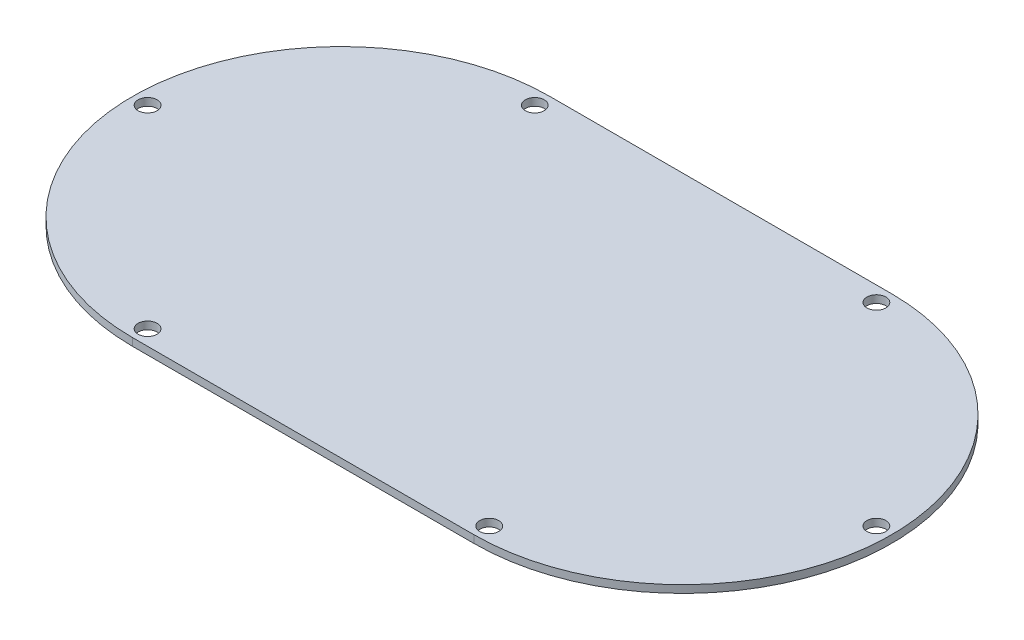
ISO-10303-21;
HEADER;
FILE_DESCRIPTION(('STEP AP214'),'2;1');
FILE_NAME('part.step','',(''),(''),'','','');
FILE_SCHEMA(('AUTOMOTIVE_DESIGN { 1 0 10303 214 1 1 1 1 }'));
ENDSEC;
DATA;
#1=APPLICATION_CONTEXT('core data for automotive mechanical design processes');
#2=APPLICATION_PROTOCOL_DEFINITION('international standard','automotive_design',2000,#1);
#3=PRODUCT_CONTEXT('',#1,'mechanical');
#4=PRODUCT('Part','Part','',(#3));
#5=PRODUCT_RELATED_PRODUCT_CATEGORY('part','',(#4));
#6=PRODUCT_DEFINITION_FORMATION('','',#4);
#7=PRODUCT_DEFINITION_CONTEXT('part definition',#1,'design');
#8=PRODUCT_DEFINITION('design','',#6,#7);
#9=PRODUCT_DEFINITION_SHAPE('','',#8);
#10=(LENGTH_UNIT() NAMED_UNIT(*) SI_UNIT(.MILLI.,.METRE.));
#11=(NAMED_UNIT(*) PLANE_ANGLE_UNIT() SI_UNIT($,.RADIAN.));
#12=(NAMED_UNIT(*) SI_UNIT($,.STERADIAN.) SOLID_ANGLE_UNIT());
#13=UNCERTAINTY_MEASURE_WITH_UNIT(LENGTH_MEASURE(1.E-05),#10,'distance_accuracy_value','');
#14=(GEOMETRIC_REPRESENTATION_CONTEXT(3) GLOBAL_UNCERTAINTY_ASSIGNED_CONTEXT((#13)) GLOBAL_UNIT_ASSIGNED_CONTEXT((#10,
#11,#12)) REPRESENTATION_CONTEXT('',''));
#15=CARTESIAN_POINT('',(0.,0.,0.));
#16=DIRECTION('',(0.,0.,1.));
#17=DIRECTION('',(1.,0.,0.));
#18=AXIS2_PLACEMENT_3D('',#15,#16,#17);
#19=CARTESIAN_POINT('',(-45.,2.,0.));
#20=DIRECTION('',(0.,1.,0.));
#21=DIRECTION('',(0.,0.,1.));
#22=AXIS2_PLACEMENT_3D('',#19,#20,#21);
#23=PLANE('',#22);
#24=CARTESIAN_POINT('',(96.,2.,0.));
#25=DIRECTION('',(0.,1.,0.));
#26=DIRECTION('',(0.,0.,-1.));
#27=AXIS2_PLACEMENT_3D('',#24,#25,#26);
#28=CIRCLE('',#27,2.49999999999999);
#29=CARTESIAN_POINT('',(96.,2.,-2.49999999999999));
#30=VERTEX_POINT('',#29);
#31=EDGE_CURVE('E139',#30,#30,#28,.T.);
#32=ORIENTED_EDGE('',*,*,#31,.F.);
#33=EDGE_LOOP('',(#32));
#34=FACE_BOUND('',#33,.T.);
#35=CARTESIAN_POINT('',(-45.,2.,51.));
#36=DIRECTION('',(0.,1.,0.));
#37=DIRECTION('',(0.,0.,1.));
#38=AXIS2_PLACEMENT_3D('',#35,#36,#37);
#39=CIRCLE('',#38,2.5);
#40=CARTESIAN_POINT('',(-45.,2.,53.5));
#41=VERTEX_POINT('',#40);
#42=EDGE_CURVE('E127',#41,#41,#39,.T.);
#43=ORIENTED_EDGE('',*,*,#42,.F.);
#44=EDGE_LOOP('',(#43));
#45=FACE_BOUND('',#44,.T.);
#46=CARTESIAN_POINT('',(-45.,2.,-51.));
#47=DIRECTION('',(0.,1.,0.));
#48=DIRECTION('',(0.,0.,1.));
#49=AXIS2_PLACEMENT_3D('',#46,#47,#48);
#50=CIRCLE('',#49,2.5);
#51=CARTESIAN_POINT('',(-45.,2.,-48.5));
#52=VERTEX_POINT('',#51);
#53=EDGE_CURVE('E106',#52,#52,#50,.T.);
#54=ORIENTED_EDGE('',*,*,#53,.F.);
#55=EDGE_LOOP('',(#54));
#56=FACE_BOUND('',#55,.T.);
#57=CARTESIAN_POINT('',(-45.,2.,0.));
#58=DIRECTION('',(0.,1.,0.));
#59=DIRECTION('',(0.,0.,1.));
#60=AXIS2_PLACEMENT_3D('',#57,#58,#59);
#61=CIRCLE('',#60,55.);
#62=CARTESIAN_POINT('',(-45.,2.,-55.));
#63=VERTEX_POINT('',#62);
#64=CARTESIAN_POINT('',(-45.,2.,55.));
#65=VERTEX_POINT('',#64);
#66=EDGE_CURVE('E91',#63,#65,#61,.T.);
#67=ORIENTED_EDGE('',*,*,#66,.T.);
#68=DIRECTION('',(1.,0.,0.));
#69=VECTOR('',#68,1.);
#70=CARTESIAN_POINT('',(-45.,2.,55.));
#71=LINE('',#70,#69);
#72=CARTESIAN_POINT('',(45.,2.,55.));
#73=VERTEX_POINT('',#72);
#74=EDGE_CURVE('E86',#65,#73,#71,.T.);
#75=ORIENTED_EDGE('',*,*,#74,.T.);
#76=CARTESIAN_POINT('',(45.,2.,0.));
#77=DIRECTION('',(0.,1.,0.));
#78=DIRECTION('',(0.,0.,1.));
#79=AXIS2_PLACEMENT_3D('',#76,#77,#78);
#80=CIRCLE('',#79,55.);
#81=CARTESIAN_POINT('',(45.,2.,-55.));
#82=VERTEX_POINT('',#81);
#83=EDGE_CURVE('E89',#73,#82,#80,.T.);
#84=ORIENTED_EDGE('',*,*,#83,.T.);
#85=DIRECTION('',(-1.,0.,0.));
#86=VECTOR('',#85,1.);
#87=CARTESIAN_POINT('',(-45.,2.,-55.));
#88=LINE('',#87,#86);
#89=EDGE_CURVE('E56',#82,#63,#88,.T.);
#90=ORIENTED_EDGE('',*,*,#89,.T.);
#91=EDGE_LOOP('',(#67,#75,#84,#90));
#92=FACE_BOUND('',#91,.T.);
#93=CARTESIAN_POINT('',(-96.,2.,0.));
#94=DIRECTION('',(0.,1.,0.));
#95=DIRECTION('',(0.,0.,1.));
#96=AXIS2_PLACEMENT_3D('',#93,#94,#95);
#97=CIRCLE('',#96,2.49999999999999);
#98=CARTESIAN_POINT('',(-96.,2.,2.5));
#99=VERTEX_POINT('',#98);
#100=EDGE_CURVE('E121',#99,#99,#97,.T.);
#101=ORIENTED_EDGE('',*,*,#100,.F.);
#102=EDGE_LOOP('',(#101));
#103=FACE_BOUND('',#102,.T.);
#104=CARTESIAN_POINT('',(45.,2.,51.));
#105=DIRECTION('',(0.,1.,0.));
#106=DIRECTION('',(0.,0.,-1.));
#107=AXIS2_PLACEMENT_3D('',#104,#105,#106);
#108=CIRCLE('',#107,2.5);
#109=CARTESIAN_POINT('',(45.,2.,48.5));
#110=VERTEX_POINT('',#109);
#111=EDGE_CURVE('E133',#110,#110,#108,.T.);
#112=ORIENTED_EDGE('',*,*,#111,.F.);
#113=EDGE_LOOP('',(#112));
#114=FACE_BOUND('',#113,.T.);
#115=CARTESIAN_POINT('',(45.,2.,-51.));
#116=DIRECTION('',(0.,1.,0.));
#117=DIRECTION('',(0.,0.,-1.));
#118=AXIS2_PLACEMENT_3D('',#115,#116,#117);
#119=CIRCLE('',#118,2.5);
#120=CARTESIAN_POINT('',(45.,2.,-53.5));
#121=VERTEX_POINT('',#120);
#122=EDGE_CURVE('E145',#121,#121,#119,.T.);
#123=ORIENTED_EDGE('',*,*,#122,.F.);
#124=EDGE_LOOP('',(#123));
#125=FACE_BOUND('',#124,.T.);
#126=ADVANCED_FACE('F39',(#34,#45,#56,#92,#103,#114,#125),#23,.T.);
#127=CARTESIAN_POINT('',(-45.,0.,0.));
#128=DIRECTION('',(0.,1.,0.));
#129=DIRECTION('',(0.,0.,1.));
#130=AXIS2_PLACEMENT_3D('',#127,#128,#129);
#131=PLANE('',#130);
#132=CARTESIAN_POINT('',(-45.,0.,0.));
#133=DIRECTION('',(0.,1.,0.));
#134=DIRECTION('',(0.,0.,1.));
#135=AXIS2_PLACEMENT_3D('',#132,#133,#134);
#136=CIRCLE('',#135,55.);
#137=CARTESIAN_POINT('',(-45.,0.,-55.));
#138=VERTEX_POINT('',#137);
#139=CARTESIAN_POINT('',(-45.,0.,55.));
#140=VERTEX_POINT('',#139);
#141=EDGE_CURVE('E103',#138,#140,#136,.T.);
#142=ORIENTED_EDGE('',*,*,#141,.F.);
#143=DIRECTION('',(-1.,0.,0.));
#144=VECTOR('',#143,1.);
#145=CARTESIAN_POINT('',(-45.,0.,-55.));
#146=LINE('',#145,#144);
#147=CARTESIAN_POINT('',(45.,0.,-55.));
#148=VERTEX_POINT('',#147);
#149=EDGE_CURVE('E79',#148,#138,#146,.T.);
#150=ORIENTED_EDGE('',*,*,#149,.F.);
#151=CARTESIAN_POINT('',(45.,0.,0.));
#152=DIRECTION('',(0.,1.,0.));
#153=DIRECTION('',(0.,0.,1.));
#154=AXIS2_PLACEMENT_3D('',#151,#152,#153);
#155=CIRCLE('',#154,55.);
#156=CARTESIAN_POINT('',(45.,0.,55.));
#157=VERTEX_POINT('',#156);
#158=EDGE_CURVE('E73',#157,#148,#155,.T.);
#159=ORIENTED_EDGE('',*,*,#158,.F.);
#160=DIRECTION('',(1.,0.,0.));
#161=VECTOR('',#160,1.);
#162=CARTESIAN_POINT('',(-45.,0.,55.));
#163=LINE('',#162,#161);
#164=EDGE_CURVE('E95',#140,#157,#163,.T.);
#165=ORIENTED_EDGE('',*,*,#164,.F.);
#166=EDGE_LOOP('',(#142,#150,#159,#165));
#167=FACE_BOUND('',#166,.T.);
#168=CARTESIAN_POINT('',(-45.,0.,-51.));
#169=DIRECTION('',(0.,1.,0.));
#170=DIRECTION('',(0.,0.,1.));
#171=AXIS2_PLACEMENT_3D('',#168,#169,#170);
#172=CIRCLE('',#171,2.5);
#173=CARTESIAN_POINT('',(-45.,0.,-48.5));
#174=VERTEX_POINT('',#173);
#175=EDGE_CURVE('E118',#174,#174,#172,.T.);
#176=ORIENTED_EDGE('',*,*,#175,.T.);
#177=EDGE_LOOP('',(#176));
#178=FACE_BOUND('',#177,.T.);
#179=CARTESIAN_POINT('',(-96.,0.,0.));
#180=DIRECTION('',(0.,1.,0.));
#181=DIRECTION('',(0.,0.,1.));
#182=AXIS2_PLACEMENT_3D('',#179,#180,#181);
#183=CIRCLE('',#182,2.49999999999999);
#184=CARTESIAN_POINT('',(-96.,0.,2.5));
#185=VERTEX_POINT('',#184);
#186=EDGE_CURVE('E124',#185,#185,#183,.T.);
#187=ORIENTED_EDGE('',*,*,#186,.T.);
#188=EDGE_LOOP('',(#187));
#189=FACE_BOUND('',#188,.T.);
#190=CARTESIAN_POINT('',(-45.,0.,51.));
#191=DIRECTION('',(0.,1.,0.));
#192=DIRECTION('',(0.,0.,1.));
#193=AXIS2_PLACEMENT_3D('',#190,#191,#192);
#194=CIRCLE('',#193,2.5);
#195=CARTESIAN_POINT('',(-45.,0.,53.5));
#196=VERTEX_POINT('',#195);
#197=EDGE_CURVE('E130',#196,#196,#194,.T.);
#198=ORIENTED_EDGE('',*,*,#197,.T.);
#199=EDGE_LOOP('',(#198));
#200=FACE_BOUND('',#199,.T.);
#201=CARTESIAN_POINT('',(45.,0.,51.));
#202=DIRECTION('',(0.,1.,0.));
#203=DIRECTION('',(0.,0.,-1.));
#204=AXIS2_PLACEMENT_3D('',#201,#202,#203);
#205=CIRCLE('',#204,2.5);
#206=CARTESIAN_POINT('',(45.,0.,48.5));
#207=VERTEX_POINT('',#206);
#208=EDGE_CURVE('E136',#207,#207,#205,.T.);
#209=ORIENTED_EDGE('',*,*,#208,.T.);
#210=EDGE_LOOP('',(#209));
#211=FACE_BOUND('',#210,.T.);
#212=CARTESIAN_POINT('',(96.,0.,0.));
#213=DIRECTION('',(0.,1.,0.));
#214=DIRECTION('',(0.,0.,-1.));
#215=AXIS2_PLACEMENT_3D('',#212,#213,#214);
#216=CIRCLE('',#215,2.49999999999999);
#217=CARTESIAN_POINT('',(96.,0.,-2.49999999999999));
#218=VERTEX_POINT('',#217);
#219=EDGE_CURVE('E142',#218,#218,#216,.T.);
#220=ORIENTED_EDGE('',*,*,#219,.T.);
#221=EDGE_LOOP('',(#220));
#222=FACE_BOUND('',#221,.T.);
#223=CARTESIAN_POINT('',(45.,0.,-51.));
#224=DIRECTION('',(0.,1.,0.));
#225=DIRECTION('',(0.,0.,-1.));
#226=AXIS2_PLACEMENT_3D('',#223,#224,#225);
#227=CIRCLE('',#226,2.5);
#228=CARTESIAN_POINT('',(45.,0.,-53.5));
#229=VERTEX_POINT('',#228);
#230=EDGE_CURVE('E148',#229,#229,#227,.T.);
#231=ORIENTED_EDGE('',*,*,#230,.T.);
#232=EDGE_LOOP('',(#231));
#233=FACE_BOUND('',#232,.T.);
#234=ADVANCED_FACE('F114',(#167,#178,#189,#200,#211,#222,#233),#131,.F.);
#235=CARTESIAN_POINT('',(-45.,2.,0.));
#236=DIRECTION('',(0.,-1.,0.));
#237=DIRECTION('',(0.,0.,-1.));
#238=AXIS2_PLACEMENT_3D('',#235,#236,#237);
#239=CYLINDRICAL_SURFACE('',#238,55.);
#240=ORIENTED_EDGE('',*,*,#141,.T.);
#241=DIRECTION('',(0.,-1.,0.));
#242=VECTOR('',#241,1.);
#243=CARTESIAN_POINT('',(-45.,2.,55.));
#244=LINE('',#243,#242);
#245=EDGE_CURVE('E11',#65,#140,#244,.T.);
#246=ORIENTED_EDGE('',*,*,#245,.F.);
#247=ORIENTED_EDGE('',*,*,#66,.F.);
#248=DIRECTION('',(0.,-1.,0.));
#249=VECTOR('',#248,1.);
#250=CARTESIAN_POINT('',(-45.,2.,-55.));
#251=LINE('',#250,#249);
#252=EDGE_CURVE('E99',#63,#138,#251,.T.);
#253=ORIENTED_EDGE('',*,*,#252,.T.);
#254=EDGE_LOOP('',(#240,#246,#247,#253));
#255=FACE_BOUND('',#254,.T.);
#256=ADVANCED_FACE('F41',(#255),#239,.T.);
#257=CARTESIAN_POINT('',(-45.,2.,55.));
#258=DIRECTION('',(0.,0.,-1.));
#259=DIRECTION('',(-1.,0.,0.));
#260=AXIS2_PLACEMENT_3D('',#257,#258,#259);
#261=PLANE('',#260);
#262=ORIENTED_EDGE('',*,*,#164,.T.);
#263=DIRECTION('',(0.,-1.,0.));
#264=VECTOR('',#263,1.);
#265=CARTESIAN_POINT('',(45.,2.,55.));
#266=LINE('',#265,#264);
#267=EDGE_CURVE('E48',#73,#157,#266,.T.);
#268=ORIENTED_EDGE('',*,*,#267,.F.);
#269=ORIENTED_EDGE('',*,*,#74,.F.);
#270=ORIENTED_EDGE('',*,*,#245,.T.);
#271=EDGE_LOOP('',(#262,#268,#269,#270));
#272=FACE_BOUND('',#271,.T.);
#273=ADVANCED_FACE('F94',(#272),#261,.F.);
#274=CARTESIAN_POINT('',(45.,2.,0.));
#275=DIRECTION('',(0.,-1.,0.));
#276=DIRECTION('',(0.,0.,-1.));
#277=AXIS2_PLACEMENT_3D('',#274,#275,#276);
#278=CYLINDRICAL_SURFACE('',#277,55.);
#279=ORIENTED_EDGE('',*,*,#158,.T.);
#280=DIRECTION('',(0.,-1.,0.));
#281=VECTOR('',#280,1.);
#282=CARTESIAN_POINT('',(45.,2.,-55.));
#283=LINE('',#282,#281);
#284=EDGE_CURVE('E96',#82,#148,#283,.T.);
#285=ORIENTED_EDGE('',*,*,#284,.F.);
#286=ORIENTED_EDGE('',*,*,#83,.F.);
#287=ORIENTED_EDGE('',*,*,#267,.T.);
#288=EDGE_LOOP('',(#279,#285,#286,#287));
#289=FACE_BOUND('',#288,.T.);
#290=ADVANCED_FACE('F97',(#289),#278,.T.);
#291=CARTESIAN_POINT('',(-45.,2.,-55.));
#292=DIRECTION('',(0.,0.,1.));
#293=DIRECTION('',(1.,0.,0.));
#294=AXIS2_PLACEMENT_3D('',#291,#292,#293);
#295=PLANE('',#294);
#296=ORIENTED_EDGE('',*,*,#149,.T.);
#297=ORIENTED_EDGE('',*,*,#252,.F.);
#298=ORIENTED_EDGE('',*,*,#89,.F.);
#299=ORIENTED_EDGE('',*,*,#284,.T.);
#300=EDGE_LOOP('',(#296,#297,#298,#299));
#301=FACE_BOUND('',#300,.T.);
#302=ADVANCED_FACE('F111',(#301),#295,.F.);
#303=CARTESIAN_POINT('',(-45.,2.,-51.));
#304=DIRECTION('',(0.,-1.,0.));
#305=DIRECTION('',(0.,0.,-1.));
#306=AXIS2_PLACEMENT_3D('',#303,#304,#305);
#307=CYLINDRICAL_SURFACE('',#306,2.5);
#308=ORIENTED_EDGE('',*,*,#53,.T.);
#309=EDGE_LOOP('',(#308));
#310=FACE_BOUND('',#309,.T.);
#311=ORIENTED_EDGE('',*,*,#175,.F.);
#312=EDGE_LOOP('',(#311));
#313=FACE_BOUND('',#312,.T.);
#314=ADVANCED_FACE('F167',(#310,#313),#307,.F.);
#315=CARTESIAN_POINT('',(-96.,2.,0.));
#316=DIRECTION('',(0.,-1.,0.));
#317=DIRECTION('',(0.,0.,-1.));
#318=AXIS2_PLACEMENT_3D('',#315,#316,#317);
#319=CYLINDRICAL_SURFACE('',#318,2.49999999999999);
#320=ORIENTED_EDGE('',*,*,#100,.T.);
#321=EDGE_LOOP('',(#320));
#322=FACE_BOUND('',#321,.T.);
#323=ORIENTED_EDGE('',*,*,#186,.F.);
#324=EDGE_LOOP('',(#323));
#325=FACE_BOUND('',#324,.T.);
#326=ADVANCED_FACE('F221',(#322,#325),#319,.F.);
#327=CARTESIAN_POINT('',(-45.,2.,51.));
#328=DIRECTION('',(0.,-1.,0.));
#329=DIRECTION('',(0.,0.,-1.));
#330=AXIS2_PLACEMENT_3D('',#327,#328,#329);
#331=CYLINDRICAL_SURFACE('',#330,2.5);
#332=ORIENTED_EDGE('',*,*,#42,.T.);
#333=EDGE_LOOP('',(#332));
#334=FACE_BOUND('',#333,.T.);
#335=ORIENTED_EDGE('',*,*,#197,.F.);
#336=EDGE_LOOP('',(#335));
#337=FACE_BOUND('',#336,.T.);
#338=ADVANCED_FACE('F230',(#334,#337),#331,.F.);
#339=CARTESIAN_POINT('',(45.,2.,51.));
#340=DIRECTION('',(0.,-1.,0.));
#341=DIRECTION('',(0.,0.,-1.));
#342=AXIS2_PLACEMENT_3D('',#339,#340,#341);
#343=CYLINDRICAL_SURFACE('',#342,2.5);
#344=ORIENTED_EDGE('',*,*,#111,.T.);
#345=EDGE_LOOP('',(#344));
#346=FACE_BOUND('',#345,.T.);
#347=ORIENTED_EDGE('',*,*,#208,.F.);
#348=EDGE_LOOP('',(#347));
#349=FACE_BOUND('',#348,.T.);
#350=ADVANCED_FACE('F239',(#346,#349),#343,.F.);
#351=CARTESIAN_POINT('',(96.,2.,0.));
#352=DIRECTION('',(0.,-1.,0.));
#353=DIRECTION('',(0.,0.,-1.));
#354=AXIS2_PLACEMENT_3D('',#351,#352,#353);
#355=CYLINDRICAL_SURFACE('',#354,2.49999999999999);
#356=ORIENTED_EDGE('',*,*,#31,.T.);
#357=EDGE_LOOP('',(#356));
#358=FACE_BOUND('',#357,.T.);
#359=ORIENTED_EDGE('',*,*,#219,.F.);
#360=EDGE_LOOP('',(#359));
#361=FACE_BOUND('',#360,.T.);
#362=ADVANCED_FACE('F249',(#358,#361),#355,.F.);
#363=CARTESIAN_POINT('',(45.,2.,-51.));
#364=DIRECTION('',(0.,-1.,0.));
#365=DIRECTION('',(0.,0.,-1.));
#366=AXIS2_PLACEMENT_3D('',#363,#364,#365);
#367=CYLINDRICAL_SURFACE('',#366,2.5);
#368=ORIENTED_EDGE('',*,*,#122,.T.);
#369=EDGE_LOOP('',(#368));
#370=FACE_BOUND('',#369,.T.);
#371=ORIENTED_EDGE('',*,*,#230,.F.);
#372=EDGE_LOOP('',(#371));
#373=FACE_BOUND('',#372,.T.);
#374=ADVANCED_FACE('F154',(#370,#373),#367,.F.);
#375=CLOSED_SHELL('',(#126,#234,#256,#273,#290,#302,#314,#326,#338,#350,#362,#374));
#376=MANIFOLD_SOLID_BREP('B2',#375);
#377=ADVANCED_BREP_SHAPE_REPRESENTATION('',(#18,#376),#14);
#378=SHAPE_DEFINITION_REPRESENTATION(#9,#377);
ENDSEC;
END-ISO-10303-21;
